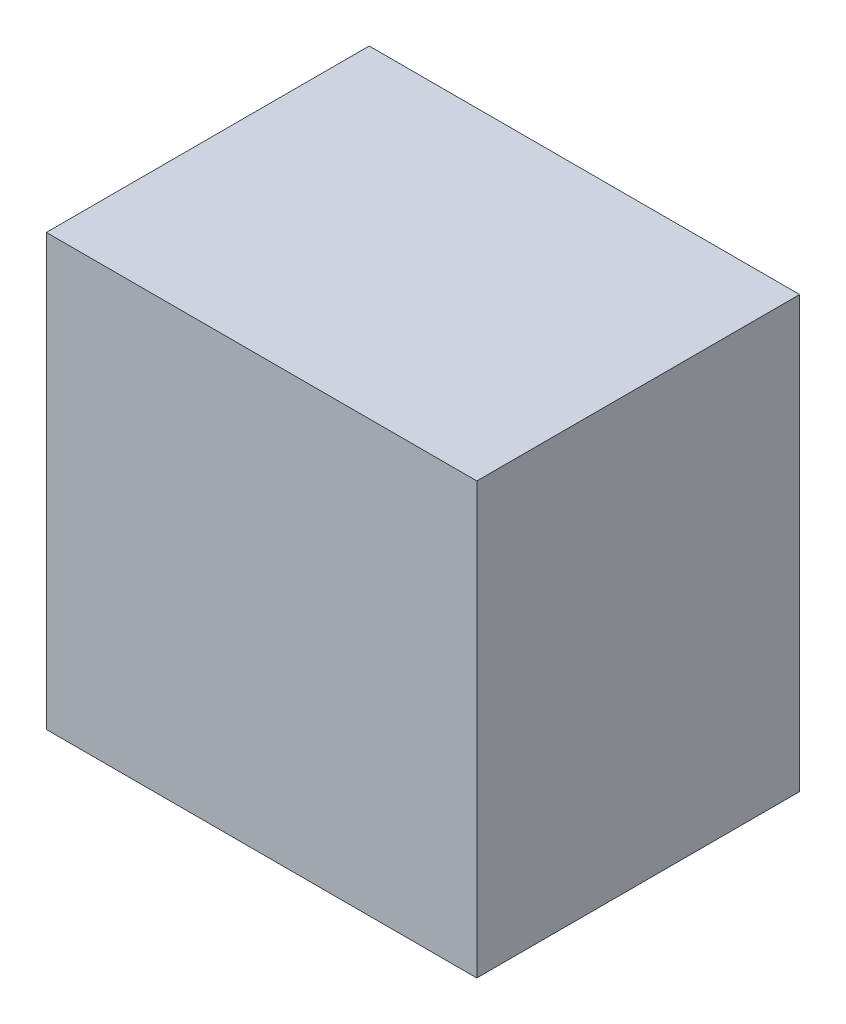
ISO-10303-21;
HEADER;
FILE_DESCRIPTION(('STEP AP214'),'2;1');
FILE_NAME('part.step','',(''),(''),'','','');
FILE_SCHEMA(('AUTOMOTIVE_DESIGN { 1 0 10303 214 1 1 1 1 }'));
ENDSEC;
DATA;
#1=APPLICATION_CONTEXT('core data for automotive mechanical design processes');
#2=APPLICATION_PROTOCOL_DEFINITION('international standard','automotive_design',2000,#1);
#3=PRODUCT_CONTEXT('',#1,'mechanical');
#4=PRODUCT('Part','Part','',(#3));
#5=PRODUCT_RELATED_PRODUCT_CATEGORY('part','',(#4));
#6=PRODUCT_DEFINITION_FORMATION('','',#4);
#7=PRODUCT_DEFINITION_CONTEXT('part definition',#1,'design');
#8=PRODUCT_DEFINITION('design','',#6,#7);
#9=PRODUCT_DEFINITION_SHAPE('','',#8);
#10=(LENGTH_UNIT() NAMED_UNIT(*) SI_UNIT(.MILLI.,.METRE.));
#11=(NAMED_UNIT(*) PLANE_ANGLE_UNIT() SI_UNIT($,.RADIAN.));
#12=(NAMED_UNIT(*) SI_UNIT($,.STERADIAN.) SOLID_ANGLE_UNIT());
#13=UNCERTAINTY_MEASURE_WITH_UNIT(LENGTH_MEASURE(1.E-05),#10,'distance_accuracy_value','');
#14=(GEOMETRIC_REPRESENTATION_CONTEXT(3) GLOBAL_UNCERTAINTY_ASSIGNED_CONTEXT((#13)) GLOBAL_UNIT_ASSIGNED_CONTEXT((#10,
#11,#12)) REPRESENTATION_CONTEXT('',''));
#15=CARTESIAN_POINT('',(0.,0.,0.));
#16=DIRECTION('',(0.,0.,1.));
#17=DIRECTION('',(1.,0.,0.));
#18=AXIS2_PLACEMENT_3D('',#15,#16,#17);
#19=CARTESIAN_POINT('',(-25.4,25.4,38.1));
#20=DIRECTION('',(0.,-1.,0.));
#21=DIRECTION('',(0.,0.,-1.));
#22=AXIS2_PLACEMENT_3D('',#19,#20,#21);
#23=PLANE('',#22);
#24=DIRECTION('',(-1.,0.,0.));
#25=VECTOR('',#24,1.);
#26=CARTESIAN_POINT('',(-25.4,25.4,0.));
#27=LINE('',#26,#25);
#28=CARTESIAN_POINT('',(25.4,25.4,0.));
#29=VERTEX_POINT('',#28);
#30=CARTESIAN_POINT('',(-25.4,25.4,0.));
#31=VERTEX_POINT('',#30);
#32=EDGE_CURVE('E98',#29,#31,#27,.T.);
#33=ORIENTED_EDGE('',*,*,#32,.T.);
#34=DIRECTION('',(0.,0.,-1.));
#35=VECTOR('',#34,1.);
#36=CARTESIAN_POINT('',(-25.4,25.4,38.1));
#37=LINE('',#36,#35);
#38=CARTESIAN_POINT('',(-25.4,25.4,38.1));
#39=VERTEX_POINT('',#38);
#40=EDGE_CURVE('E11',#39,#31,#37,.T.);
#41=ORIENTED_EDGE('',*,*,#40,.F.);
#42=DIRECTION('',(-1.,0.,0.));
#43=VECTOR('',#42,1.);
#44=CARTESIAN_POINT('',(-25.4,25.4,38.1));
#45=LINE('',#44,#43);
#46=CARTESIAN_POINT('',(25.4,25.4,38.1));
#47=VERTEX_POINT('',#46);
#48=EDGE_CURVE('E86',#47,#39,#45,.T.);
#49=ORIENTED_EDGE('',*,*,#48,.F.);
#50=DIRECTION('',(0.,0.,-1.));
#51=VECTOR('',#50,1.);
#52=CARTESIAN_POINT('',(25.4,25.4,38.1));
#53=LINE('',#52,#51);
#54=EDGE_CURVE('E94',#47,#29,#53,.T.);
#55=ORIENTED_EDGE('',*,*,#54,.T.);
#56=EDGE_LOOP('',(#33,#41,#49,#55));
#57=FACE_BOUND('',#56,.T.);
#58=ADVANCED_FACE('F35',(#57),#23,.F.);
#59=CARTESIAN_POINT('',(-25.4,-25.4,38.1));
#60=DIRECTION('',(1.,0.,0.));
#61=DIRECTION('',(0.,0.,-1.));
#62=AXIS2_PLACEMENT_3D('',#59,#60,#61);
#63=PLANE('',#62);
#64=DIRECTION('',(0.,-1.,0.));
#65=VECTOR('',#64,1.);
#66=CARTESIAN_POINT('',(-25.4,-25.4,0.));
#67=LINE('',#66,#65);
#68=CARTESIAN_POINT('',(-25.4,-25.4,0.));
#69=VERTEX_POINT('',#68);
#70=EDGE_CURVE('E90',#31,#69,#67,.T.);
#71=ORIENTED_EDGE('',*,*,#70,.T.);
#72=DIRECTION('',(0.,0.,-1.));
#73=VECTOR('',#72,1.);
#74=CARTESIAN_POINT('',(-25.4,-25.4,38.1));
#75=LINE('',#74,#73);
#76=CARTESIAN_POINT('',(-25.4,-25.4,38.1));
#77=VERTEX_POINT('',#76);
#78=EDGE_CURVE('E43',#77,#69,#75,.T.);
#79=ORIENTED_EDGE('',*,*,#78,.F.);
#80=DIRECTION('',(0.,-1.,0.));
#81=VECTOR('',#80,1.);
#82=CARTESIAN_POINT('',(-25.4,-25.4,38.1));
#83=LINE('',#82,#81);
#84=EDGE_CURVE('E81',#39,#77,#83,.T.);
#85=ORIENTED_EDGE('',*,*,#84,.F.);
#86=ORIENTED_EDGE('',*,*,#40,.T.);
#87=EDGE_LOOP('',(#71,#79,#85,#86));
#88=FACE_BOUND('',#87,.T.);
#89=ADVANCED_FACE('F89',(#88),#63,.F.);
#90=CARTESIAN_POINT('',(-25.4,-25.4,38.1));
#91=DIRECTION('',(0.,1.,0.));
#92=DIRECTION('',(0.,0.,1.));
#93=AXIS2_PLACEMENT_3D('',#90,#91,#92);
#94=PLANE('',#93);
#95=DIRECTION('',(1.,0.,0.));
#96=VECTOR('',#95,1.);
#97=CARTESIAN_POINT('',(-25.4,-25.4,0.));
#98=LINE('',#97,#96);
#99=CARTESIAN_POINT('',(25.4,-25.4,0.));
#100=VERTEX_POINT('',#99);
#101=EDGE_CURVE('E68',#69,#100,#98,.T.);
#102=ORIENTED_EDGE('',*,*,#101,.T.);
#103=DIRECTION('',(0.,0.,-1.));
#104=VECTOR('',#103,1.);
#105=CARTESIAN_POINT('',(25.4,-25.4,38.1));
#106=LINE('',#105,#104);
#107=CARTESIAN_POINT('',(25.4,-25.4,38.1));
#108=VERTEX_POINT('',#107);
#109=EDGE_CURVE('E91',#108,#100,#106,.T.);
#110=ORIENTED_EDGE('',*,*,#109,.F.);
#111=DIRECTION('',(1.,0.,0.));
#112=VECTOR('',#111,1.);
#113=CARTESIAN_POINT('',(-25.4,-25.4,38.1));
#114=LINE('',#113,#112);
#115=EDGE_CURVE('E84',#77,#108,#114,.T.);
#116=ORIENTED_EDGE('',*,*,#115,.F.);
#117=ORIENTED_EDGE('',*,*,#78,.T.);
#118=EDGE_LOOP('',(#102,#110,#116,#117));
#119=FACE_BOUND('',#118,.T.);
#120=ADVANCED_FACE('F92',(#119),#94,.F.);
#121=CARTESIAN_POINT('',(25.4,25.4,38.1));
#122=DIRECTION('',(-1.,0.,0.));
#123=DIRECTION('',(0.,-1.,0.));
#124=AXIS2_PLACEMENT_3D('',#121,#122,#123);
#125=PLANE('',#124);
#126=DIRECTION('',(0.,1.,0.));
#127=VECTOR('',#126,1.);
#128=CARTESIAN_POINT('',(25.4,25.4,0.));
#129=LINE('',#128,#127);
#130=EDGE_CURVE('E74',#100,#29,#129,.T.);
#131=ORIENTED_EDGE('',*,*,#130,.T.);
#132=ORIENTED_EDGE('',*,*,#54,.F.);
#133=DIRECTION('',(0.,1.,0.));
#134=VECTOR('',#133,1.);
#135=CARTESIAN_POINT('',(25.4,25.4,38.1));
#136=LINE('',#135,#134);
#137=EDGE_CURVE('E51',#108,#47,#136,.T.);
#138=ORIENTED_EDGE('',*,*,#137,.F.);
#139=ORIENTED_EDGE('',*,*,#109,.T.);
#140=EDGE_LOOP('',(#131,#132,#138,#139));
#141=FACE_BOUND('',#140,.T.);
#142=ADVANCED_FACE('F105',(#141),#125,.F.);
#143=CARTESIAN_POINT('',(0.,0.,38.1));
#144=DIRECTION('',(0.,0.,-1.));
#145=DIRECTION('',(-1.,0.,0.));
#146=AXIS2_PLACEMENT_3D('',#143,#144,#145);
#147=PLANE('',#146);
#148=ORIENTED_EDGE('',*,*,#48,.T.);
#149=ORIENTED_EDGE('',*,*,#84,.T.);
#150=ORIENTED_EDGE('',*,*,#115,.T.);
#151=ORIENTED_EDGE('',*,*,#137,.T.);
#152=EDGE_LOOP('',(#148,#149,#150,#151));
#153=FACE_BOUND('',#152,.T.);
#154=ADVANCED_FACE('F82',(#153),#147,.F.);
#155=CARTESIAN_POINT('',(0.,0.,0.));
#156=DIRECTION('',(0.,0.,-1.));
#157=DIRECTION('',(-1.,0.,0.));
#158=AXIS2_PLACEMENT_3D('',#155,#156,#157);
#159=PLANE('',#158);
#160=ORIENTED_EDGE('',*,*,#32,.F.);
#161=ORIENTED_EDGE('',*,*,#130,.F.);
#162=ORIENTED_EDGE('',*,*,#101,.F.);
#163=ORIENTED_EDGE('',*,*,#70,.F.);
#164=EDGE_LOOP('',(#160,#161,#162,#163));
#165=FACE_BOUND('',#164,.T.);
#166=ADVANCED_FACE('F108',(#165),#159,.T.);
#167=CLOSED_SHELL('',(#58,#89,#120,#142,#154,#166));
#168=MANIFOLD_SOLID_BREP('B2',#167);
#169=ADVANCED_BREP_SHAPE_REPRESENTATION('',(#18,#168),#14);
#170=SHAPE_DEFINITION_REPRESENTATION(#9,#169);
ENDSEC;
END-ISO-10303-21;
